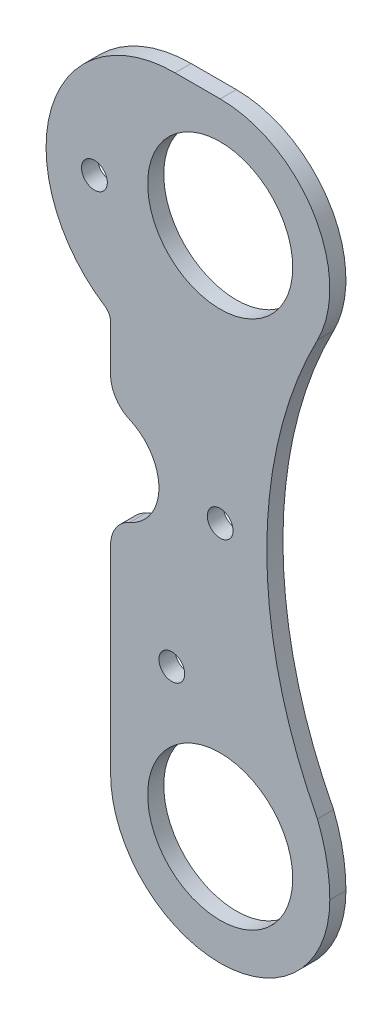
ISO-10303-21;
HEADER;
FILE_DESCRIPTION(('STEP AP214'),'2;1');
FILE_NAME('part.step','',(''),(''),'','','');
FILE_SCHEMA(('AUTOMOTIVE_DESIGN { 1 0 10303 214 1 1 1 1 }'));
ENDSEC;
DATA;
#1=APPLICATION_CONTEXT('core data for automotive mechanical design processes');
#2=APPLICATION_PROTOCOL_DEFINITION('international standard','automotive_design',2000,#1);
#3=PRODUCT_CONTEXT('',#1,'mechanical');
#4=PRODUCT('Part','Part','',(#3));
#5=PRODUCT_RELATED_PRODUCT_CATEGORY('part','',(#4));
#6=PRODUCT_DEFINITION_FORMATION('','',#4);
#7=PRODUCT_DEFINITION_CONTEXT('part definition',#1,'design');
#8=PRODUCT_DEFINITION('design','',#6,#7);
#9=PRODUCT_DEFINITION_SHAPE('','',#8);
#10=(LENGTH_UNIT() NAMED_UNIT(*) SI_UNIT(.MILLI.,.METRE.));
#11=(NAMED_UNIT(*) PLANE_ANGLE_UNIT() SI_UNIT($,.RADIAN.));
#12=(NAMED_UNIT(*) SI_UNIT($,.STERADIAN.) SOLID_ANGLE_UNIT());
#13=UNCERTAINTY_MEASURE_WITH_UNIT(LENGTH_MEASURE(1.E-05),#10,'distance_accuracy_value','');
#14=(GEOMETRIC_REPRESENTATION_CONTEXT(3) GLOBAL_UNCERTAINTY_ASSIGNED_CONTEXT((#13)) GLOBAL_UNIT_ASSIGNED_CONTEXT((#10,
#11,#12)) REPRESENTATION_CONTEXT('',''));
#15=CARTESIAN_POINT('',(0.,0.,0.));
#16=DIRECTION('',(0.,0.,1.));
#17=DIRECTION('',(1.,0.,0.));
#18=AXIS2_PLACEMENT_3D('',#15,#16,#17);
#19=CARTESIAN_POINT('',(0.,0.,3.175));
#20=DIRECTION('',(0.,0.,-1.));
#21=DIRECTION('',(-1.,0.,0.));
#22=AXIS2_PLACEMENT_3D('',#19,#20,#21);
#23=CYLINDRICAL_SURFACE('',#22,21.59);
#24=CARTESIAN_POINT('',(0.,0.,0.));
#25=DIRECTION('',(0.,0.,-1.));
#26=DIRECTION('',(-1.,0.,0.));
#27=AXIS2_PLACEMENT_3D('',#24,#25,#26);
#28=CIRCLE('',#27,21.59);
#29=CARTESIAN_POINT('',(0.,21.59,0.));
#30=VERTEX_POINT('',#29);
#31=CARTESIAN_POINT('',(19.1590830035103,-9.9527703914339,0.));
#32=VERTEX_POINT('',#31);
#33=EDGE_CURVE('E301',#30,#32,#28,.T.);
#34=ORIENTED_EDGE('',*,*,#33,.F.);
#35=DIRECTION('',(0.,0.,1.));
#36=VECTOR('',#35,1.);
#37=CARTESIAN_POINT('',(0.,21.59,0.));
#38=LINE('',#37,#36);
#39=CARTESIAN_POINT('',(0.,21.59,3.175));
#40=VERTEX_POINT('',#39);
#41=EDGE_CURVE('E212',#30,#40,#38,.T.);
#42=ORIENTED_EDGE('',*,*,#41,.T.);
#43=CARTESIAN_POINT('',(0.,0.,3.175));
#44=DIRECTION('',(0.,0.,-1.));
#45=DIRECTION('',(-1.,0.,0.));
#46=AXIS2_PLACEMENT_3D('',#43,#44,#45);
#47=CIRCLE('',#46,21.59);
#48=CARTESIAN_POINT('',(19.1590830035103,-9.9527703914339,3.175));
#49=VERTEX_POINT('',#48);
#50=EDGE_CURVE('E298',#40,#49,#47,.T.);
#51=ORIENTED_EDGE('',*,*,#50,.T.);
#52=DIRECTION('',(0.,0.,-1.));
#53=VECTOR('',#52,1.);
#54=CARTESIAN_POINT('',(19.1590830035103,-9.9527703914339,3.175));
#55=LINE('',#54,#53);
#56=EDGE_CURVE('E294',#49,#32,#55,.T.);
#57=ORIENTED_EDGE('',*,*,#56,.T.);
#58=EDGE_LOOP('',(#34,#42,#51,#57));
#59=FACE_BOUND('',#58,.T.);
#60=ADVANCED_FACE('F76',(#59),#23,.T.);
#61=CARTESIAN_POINT('',(8.89000000000001,12.7,3.175));
#62=DIRECTION('',(0.,0.,-1.));
#63=DIRECTION('',(-1.,0.,0.));
#64=AXIS2_PLACEMENT_3D('',#61,#62,#63);
#65=PLANE('',#64);
#66=CARTESIAN_POINT('',(-9.52499999999999,-80.01,3.175));
#67=DIRECTION('',(0.,0.,1.));
#68=DIRECTION('',(1.,0.,0.));
#69=AXIS2_PLACEMENT_3D('',#66,#67,#68);
#70=CIRCLE('',#69,2.53999999999999);
#71=CARTESIAN_POINT('',(-6.985,-80.01,3.175));
#72=VERTEX_POINT('',#71);
#73=EDGE_CURVE('E254',#72,#72,#70,.T.);
#74=ORIENTED_EDGE('',*,*,#73,.F.);
#75=EDGE_LOOP('',(#74));
#76=FACE_BOUND('',#75,.T.);
#77=CARTESIAN_POINT('',(0.,-104.23906,3.175));
#78=DIRECTION('',(0.,0.,1.));
#79=DIRECTION('',(1.,0.,0.));
#80=AXIS2_PLACEMENT_3D('',#77,#78,#79);
#81=CIRCLE('',#80,14.2875);
#82=CARTESIAN_POINT('',(14.2875,-104.23906,3.175));
#83=VERTEX_POINT('',#82);
#84=EDGE_CURVE('E245',#83,#83,#81,.T.);
#85=ORIENTED_EDGE('',*,*,#84,.F.);
#86=EDGE_LOOP('',(#85));
#87=FACE_BOUND('',#86,.T.);
#88=CARTESIAN_POINT('',(0.,-104.23906,3.175));
#89=DIRECTION('',(0.,0.,1.));
#90=DIRECTION('',(1.,0.,0.));
#91=AXIS2_PLACEMENT_3D('',#88,#89,#90);
#92=CIRCLE('',#91,21.59);
#93=CARTESIAN_POINT('',(-21.59,-104.23906,3.175));
#94=VERTEX_POINT('',#93);
#95=CARTESIAN_POINT('',(21.59,-104.23906,3.175));
#96=VERTEX_POINT('',#95);
#97=EDGE_CURVE('E185',#94,#96,#92,.T.);
#98=ORIENTED_EDGE('',*,*,#97,.T.);
#99=CARTESIAN_POINT('',(-12.2374713385836,-104.23906,3.175));
#100=DIRECTION('',(0.,0.,-1.));
#101=DIRECTION('',(-1.,0.,0.));
#102=AXIS2_PLACEMENT_3D('',#99,#100,#101);
#103=CIRCLE('',#102,33.8274713385836);
#104=CARTESIAN_POINT('',(19.1590830035103,-91.6472296085661,3.175));
#105=VERTEX_POINT('',#104);
#106=EDGE_CURVE('E168',#105,#96,#103,.T.);
#107=ORIENTED_EDGE('',*,*,#106,.F.);
#108=CARTESIAN_POINT('',(97.79,-50.8,3.175));
#109=DIRECTION('',(0.,0.,-1.));
#110=DIRECTION('',(-1.,0.,0.));
#111=AXIS2_PLACEMENT_3D('',#108,#109,#110);
#112=CIRCLE('',#111,88.6076592310381);
#113=EDGE_CURVE('E223',#105,#49,#112,.T.);
#114=ORIENTED_EDGE('',*,*,#113,.T.);
#115=ORIENTED_EDGE('',*,*,#50,.F.);
#116=DIRECTION('',(1.,0.,0.));
#117=VECTOR('',#116,1.);
#118=CARTESIAN_POINT('',(0.,21.59,3.175));
#119=LINE('',#118,#117);
#120=CARTESIAN_POINT('',(-8.89,21.59,3.175));
#121=VERTEX_POINT('',#120);
#122=EDGE_CURVE('E208',#121,#40,#119,.T.);
#123=ORIENTED_EDGE('',*,*,#122,.F.);
#124=CARTESIAN_POINT('',(-8.89,-3.81,3.175));
#125=DIRECTION('',(0.,0.,1.));
#126=DIRECTION('',(1.,0.,0.));
#127=AXIS2_PLACEMENT_3D('',#124,#125,#126);
#128=CIRCLE('',#127,25.4);
#129=CARTESIAN_POINT('',(-22.7445454545454,-25.0987662922945,3.175));
#130=VERTEX_POINT('',#129);
#131=EDGE_CURVE('E199',#121,#130,#128,.T.);
#132=ORIENTED_EDGE('',*,*,#131,.T.);
#133=CARTESIAN_POINT('',(-24.13,-27.2276429215239,3.175));
#134=DIRECTION('',(0.,0.,-1.));
#135=DIRECTION('',(-1.,0.,0.));
#136=AXIS2_PLACEMENT_3D('',#133,#134,#135);
#137=CIRCLE('',#136,2.54);
#138=CARTESIAN_POINT('',(-21.59,-27.2276429215239,3.175));
#139=VERTEX_POINT('',#138);
#140=EDGE_CURVE('E84',#130,#139,#137,.T.);
#141=ORIENTED_EDGE('',*,*,#140,.T.);
#142=DIRECTION('',(0.,-1.,0.));
#143=VECTOR('',#142,1.);
#144=CARTESIAN_POINT('',(-21.59,12.7,3.175));
#145=LINE('',#144,#143);
#146=CARTESIAN_POINT('',(-21.59,-36.2503221685152,3.175));
#147=VERTEX_POINT('',#146);
#148=EDGE_CURVE('E346',#139,#147,#145,.T.);
#149=ORIENTED_EDGE('',*,*,#148,.T.);
#150=CARTESIAN_POINT('',(-15.24,-36.2503221685152,3.175));
#151=DIRECTION('',(0.,0.,-1.));
#152=DIRECTION('',(-1.,0.,0.));
#153=AXIS2_PLACEMENT_3D('',#150,#151,#152);
#154=CIRCLE('',#153,6.35);
#155=CARTESIAN_POINT('',(-17.78,-42.0701933011091,3.175));
#156=VERTEX_POINT('',#155);
#157=EDGE_CURVE('E327',#147,#156,#154,.F.);
#158=ORIENTED_EDGE('',*,*,#157,.T.);
#159=CARTESIAN_POINT('',(-21.59,-50.8,3.175));
#160=DIRECTION('',(0.,0.,1.));
#161=DIRECTION('',(1.,0.,0.));
#162=AXIS2_PLACEMENT_3D('',#159,#160,#161);
#163=CIRCLE('',#162,9.525);
#164=CARTESIAN_POINT('',(-17.78,-59.5298066988909,3.175));
#165=VERTEX_POINT('',#164);
#166=EDGE_CURVE('E215',#165,#156,#163,.T.);
#167=ORIENTED_EDGE('',*,*,#166,.F.);
#168=CARTESIAN_POINT('',(-15.24,-65.3496778314848,3.175));
#169=DIRECTION('',(0.,0.,-1.));
#170=DIRECTION('',(-1.,0.,0.));
#171=AXIS2_PLACEMENT_3D('',#168,#169,#170);
#172=CIRCLE('',#171,6.35);
#173=CARTESIAN_POINT('',(-21.59,-65.3496778314848,3.175));
#174=VERTEX_POINT('',#173);
#175=EDGE_CURVE('E331',#165,#174,#172,.F.);
#176=ORIENTED_EDGE('',*,*,#175,.T.);
#177=EDGE_CURVE('E348',#174,#94,#145,.T.);
#178=ORIENTED_EDGE('',*,*,#177,.T.);
#179=EDGE_LOOP('',(#98,#107,#114,#115,#123,#132,#141,#149,#158,#167,#176,#178));
#180=FACE_BOUND('',#179,.T.);
#181=CARTESIAN_POINT('',(-24.765,-3.81,3.175));
#182=DIRECTION('',(0.,0.,1.));
#183=DIRECTION('',(1.,0.,0.));
#184=AXIS2_PLACEMENT_3D('',#181,#182,#183);
#185=CIRCLE('',#184,2.54);
#186=CARTESIAN_POINT('',(-22.225,-3.81,3.175));
#187=VERTEX_POINT('',#186);
#188=EDGE_CURVE('E173',#187,#187,#185,.T.);
#189=ORIENTED_EDGE('',*,*,#188,.F.);
#190=EDGE_LOOP('',(#189));
#191=FACE_BOUND('',#190,.T.);
#192=CARTESIAN_POINT('',(0.,-50.8,3.175));
#193=DIRECTION('',(0.,0.,1.));
#194=DIRECTION('',(1.,0.,0.));
#195=AXIS2_PLACEMENT_3D('',#192,#193,#194);
#196=CIRCLE('',#195,2.54);
#197=CARTESIAN_POINT('',(2.54000000000001,-50.8,3.175));
#198=VERTEX_POINT('',#197);
#199=EDGE_CURVE('E280',#198,#198,#196,.T.);
#200=ORIENTED_EDGE('',*,*,#199,.F.);
#201=EDGE_LOOP('',(#200));
#202=FACE_BOUND('',#201,.T.);
#203=CARTESIAN_POINT('',(0.,0.,3.175));
#204=DIRECTION('',(0.,0.,1.));
#205=DIRECTION('',(1.,0.,0.));
#206=AXIS2_PLACEMENT_3D('',#203,#204,#205);
#207=CIRCLE('',#206,14.2875);
#208=CARTESIAN_POINT('',(14.2875,0.,3.175));
#209=VERTEX_POINT('',#208);
#210=EDGE_CURVE('E230',#209,#209,#207,.T.);
#211=ORIENTED_EDGE('',*,*,#210,.F.);
#212=EDGE_LOOP('',(#211));
#213=FACE_BOUND('',#212,.T.);
#214=ADVANCED_FACE('F269',(#76,#87,#180,#191,#202,#213),#65,.F.);
#215=CARTESIAN_POINT('',(8.89000000000001,12.7,0.));
#216=DIRECTION('',(0.,0.,-1.));
#217=DIRECTION('',(-1.,0.,0.));
#218=AXIS2_PLACEMENT_3D('',#215,#216,#217);
#219=PLANE('',#218);
#220=CARTESIAN_POINT('',(-9.52499999999999,-80.01,0.));
#221=DIRECTION('',(0.,0.,1.));
#222=DIRECTION('',(1.,0.,0.));
#223=AXIS2_PLACEMENT_3D('',#220,#221,#222);
#224=CIRCLE('',#223,2.53999999999999);
#225=CARTESIAN_POINT('',(-6.985,-80.01,0.));
#226=VERTEX_POINT('',#225);
#227=EDGE_CURVE('E249',#226,#226,#224,.T.);
#228=ORIENTED_EDGE('',*,*,#227,.T.);
#229=EDGE_LOOP('',(#228));
#230=FACE_BOUND('',#229,.T.);
#231=CARTESIAN_POINT('',(0.,-104.23906,0.));
#232=DIRECTION('',(0.,0.,1.));
#233=DIRECTION('',(1.,0.,0.));
#234=AXIS2_PLACEMENT_3D('',#231,#232,#233);
#235=CIRCLE('',#234,14.2875);
#236=CARTESIAN_POINT('',(14.2875,-104.23906,0.));
#237=VERTEX_POINT('',#236);
#238=EDGE_CURVE('E248',#237,#237,#235,.T.);
#239=ORIENTED_EDGE('',*,*,#238,.T.);
#240=EDGE_LOOP('',(#239));
#241=FACE_BOUND('',#240,.T.);
#242=CARTESIAN_POINT('',(-12.2374713385836,-104.23906,0.));
#243=DIRECTION('',(0.,0.,-1.));
#244=DIRECTION('',(-1.,0.,0.));
#245=AXIS2_PLACEMENT_3D('',#242,#243,#244);
#246=CIRCLE('',#245,33.8274713385836);
#247=CARTESIAN_POINT('',(19.1590830035103,-91.6472296085661,0.));
#248=VERTEX_POINT('',#247);
#249=CARTESIAN_POINT('',(21.59,-104.23906,0.));
#250=VERTEX_POINT('',#249);
#251=EDGE_CURVE('E165',#248,#250,#246,.T.);
#252=ORIENTED_EDGE('',*,*,#251,.T.);
#253=CARTESIAN_POINT('',(0.,-104.23906,0.));
#254=DIRECTION('',(0.,0.,1.));
#255=DIRECTION('',(1.,0.,0.));
#256=AXIS2_PLACEMENT_3D('',#253,#254,#255);
#257=CIRCLE('',#256,21.59);
#258=CARTESIAN_POINT('',(-21.59,-104.23906,0.));
#259=VERTEX_POINT('',#258);
#260=EDGE_CURVE('E182',#259,#250,#257,.T.);
#261=ORIENTED_EDGE('',*,*,#260,.F.);
#262=DIRECTION('',(0.,-1.,0.));
#263=VECTOR('',#262,1.);
#264=CARTESIAN_POINT('',(-21.59,12.7,0.));
#265=LINE('',#264,#263);
#266=CARTESIAN_POINT('',(-21.59,-65.3496778314848,0.));
#267=VERTEX_POINT('',#266);
#268=EDGE_CURVE('E235',#267,#259,#265,.T.);
#269=ORIENTED_EDGE('',*,*,#268,.F.);
#270=CARTESIAN_POINT('',(-15.24,-65.3496778314848,0.));
#271=DIRECTION('',(0.,0.,-1.));
#272=DIRECTION('',(-1.,0.,0.));
#273=AXIS2_PLACEMENT_3D('',#270,#271,#272);
#274=CIRCLE('',#273,6.35);
#275=CARTESIAN_POINT('',(-17.78,-59.5298066988909,0.));
#276=VERTEX_POINT('',#275);
#277=EDGE_CURVE('E339',#267,#276,#274,.T.);
#278=ORIENTED_EDGE('',*,*,#277,.T.);
#279=CARTESIAN_POINT('',(-21.59,-50.8,0.));
#280=DIRECTION('',(0.,0.,1.));
#281=DIRECTION('',(1.,0.,0.));
#282=AXIS2_PLACEMENT_3D('',#279,#280,#281);
#283=CIRCLE('',#282,9.525);
#284=CARTESIAN_POINT('',(-17.78,-42.0701933011091,0.));
#285=VERTEX_POINT('',#284);
#286=EDGE_CURVE('E217',#276,#285,#283,.T.);
#287=ORIENTED_EDGE('',*,*,#286,.T.);
#288=CARTESIAN_POINT('',(-15.24,-36.2503221685152,0.));
#289=DIRECTION('',(0.,0.,-1.));
#290=DIRECTION('',(-1.,0.,0.));
#291=AXIS2_PLACEMENT_3D('',#288,#289,#290);
#292=CIRCLE('',#291,6.35);
#293=CARTESIAN_POINT('',(-21.59,-36.2503221685152,0.));
#294=VERTEX_POINT('',#293);
#295=EDGE_CURVE('E336',#285,#294,#292,.T.);
#296=ORIENTED_EDGE('',*,*,#295,.T.);
#297=CARTESIAN_POINT('',(-21.59,-27.2276429215239,0.));
#298=VERTEX_POINT('',#297);
#299=EDGE_CURVE('E347',#298,#294,#265,.T.);
#300=ORIENTED_EDGE('',*,*,#299,.F.);
#301=CARTESIAN_POINT('',(-24.13,-27.2276429215239,0.));
#302=DIRECTION('',(0.,0.,-1.));
#303=DIRECTION('',(-1.,0.,0.));
#304=AXIS2_PLACEMENT_3D('',#301,#302,#303);
#305=CIRCLE('',#304,2.54);
#306=CARTESIAN_POINT('',(-22.7445454545454,-25.0987662922945,0.));
#307=VERTEX_POINT('',#306);
#308=EDGE_CURVE('E13',#298,#307,#305,.F.);
#309=ORIENTED_EDGE('',*,*,#308,.T.);
#310=CARTESIAN_POINT('',(-8.89,-3.81,0.));
#311=DIRECTION('',(0.,0.,1.));
#312=DIRECTION('',(1.,0.,0.));
#313=AXIS2_PLACEMENT_3D('',#310,#311,#312);
#314=CIRCLE('',#313,25.4);
#315=CARTESIAN_POINT('',(-8.89,21.59,0.));
#316=VERTEX_POINT('',#315);
#317=EDGE_CURVE('E202',#316,#307,#314,.T.);
#318=ORIENTED_EDGE('',*,*,#317,.F.);
#319=DIRECTION('',(1.,0.,0.));
#320=VECTOR('',#319,1.);
#321=CARTESIAN_POINT('',(0.,21.59,0.));
#322=LINE('',#321,#320);
#323=EDGE_CURVE('E198',#316,#30,#322,.T.);
#324=ORIENTED_EDGE('',*,*,#323,.T.);
#325=ORIENTED_EDGE('',*,*,#33,.T.);
#326=CARTESIAN_POINT('',(97.79,-50.8,0.));
#327=DIRECTION('',(0.,0.,-1.));
#328=DIRECTION('',(-1.,0.,0.));
#329=AXIS2_PLACEMENT_3D('',#326,#327,#328);
#330=CIRCLE('',#329,88.6076592310381);
#331=EDGE_CURVE('E184',#248,#32,#330,.T.);
#332=ORIENTED_EDGE('',*,*,#331,.F.);
#333=EDGE_LOOP('',(#252,#261,#269,#278,#287,#296,#300,#309,#318,#324,#325,#332));
#334=FACE_BOUND('',#333,.T.);
#335=CARTESIAN_POINT('',(0.,-50.8,0.));
#336=DIRECTION('',(0.,0.,1.));
#337=DIRECTION('',(1.,0.,0.));
#338=AXIS2_PLACEMENT_3D('',#335,#336,#337);
#339=CIRCLE('',#338,2.54);
#340=CARTESIAN_POINT('',(2.54000000000001,-50.8,0.));
#341=VERTEX_POINT('',#340);
#342=EDGE_CURVE('E237',#341,#341,#339,.T.);
#343=ORIENTED_EDGE('',*,*,#342,.T.);
#344=EDGE_LOOP('',(#343));
#345=FACE_BOUND('',#344,.T.);
#346=CARTESIAN_POINT('',(0.,0.,0.));
#347=DIRECTION('',(0.,0.,1.));
#348=DIRECTION('',(1.,0.,0.));
#349=AXIS2_PLACEMENT_3D('',#346,#347,#348);
#350=CIRCLE('',#349,14.2875);
#351=CARTESIAN_POINT('',(14.2875,0.,0.));
#352=VERTEX_POINT('',#351);
#353=EDGE_CURVE('E236',#352,#352,#350,.T.);
#354=ORIENTED_EDGE('',*,*,#353,.T.);
#355=EDGE_LOOP('',(#354));
#356=FACE_BOUND('',#355,.T.);
#357=CARTESIAN_POINT('',(-24.765,-3.81,0.));
#358=DIRECTION('',(0.,0.,1.));
#359=DIRECTION('',(1.,0.,0.));
#360=AXIS2_PLACEMENT_3D('',#357,#358,#359);
#361=CIRCLE('',#360,2.54);
#362=CARTESIAN_POINT('',(-22.225,-3.81,0.));
#363=VERTEX_POINT('',#362);
#364=EDGE_CURVE('E195',#363,#363,#361,.T.);
#365=ORIENTED_EDGE('',*,*,#364,.T.);
#366=EDGE_LOOP('',(#365));
#367=FACE_BOUND('',#366,.T.);
#368=ADVANCED_FACE('F179',(#230,#241,#334,#345,#356,#367),#219,.T.);
#369=CARTESIAN_POINT('',(-21.59,12.7,3.175));
#370=DIRECTION('',(1.,0.,0.));
#371=DIRECTION('',(0.,1.,0.));
#372=AXIS2_PLACEMENT_3D('',#369,#370,#371);
#373=PLANE('',#372);
#374=ORIENTED_EDGE('',*,*,#268,.T.);
#375=DIRECTION('',(0.,0.,1.));
#376=VECTOR('',#375,1.);
#377=CARTESIAN_POINT('',(-21.59,-104.23906,0.));
#378=LINE('',#377,#376);
#379=EDGE_CURVE('E174',#259,#94,#378,.T.);
#380=ORIENTED_EDGE('',*,*,#379,.T.);
#381=ORIENTED_EDGE('',*,*,#177,.F.);
#382=DIRECTION('',(0.,0.,1.));
#383=VECTOR('',#382,1.);
#384=CARTESIAN_POINT('',(-21.59,-65.3496778314848,0.));
#385=LINE('',#384,#383);
#386=EDGE_CURVE('E323',#174,#267,#385,.F.);
#387=ORIENTED_EDGE('',*,*,#386,.T.);
#388=EDGE_LOOP('',(#374,#380,#381,#387));
#389=FACE_BOUND('',#388,.T.);
#390=ADVANCED_FACE('F355',(#389),#373,.F.);
#391=ORIENTED_EDGE('',*,*,#148,.F.);
#392=DIRECTION('',(0.,0.,1.));
#393=VECTOR('',#392,1.);
#394=CARTESIAN_POINT('',(-21.59,-27.2276429215239,3.175));
#395=LINE('',#394,#393);
#396=EDGE_CURVE('E91',#139,#298,#395,.F.);
#397=ORIENTED_EDGE('',*,*,#396,.T.);
#398=ORIENTED_EDGE('',*,*,#299,.T.);
#399=DIRECTION('',(0.,0.,1.));
#400=VECTOR('',#399,1.);
#401=CARTESIAN_POINT('',(-21.59,-36.2503221685152,3.175));
#402=LINE('',#401,#400);
#403=EDGE_CURVE('E333',#294,#147,#402,.T.);
#404=ORIENTED_EDGE('',*,*,#403,.T.);
#405=EDGE_LOOP('',(#391,#397,#398,#404));
#406=FACE_BOUND('',#405,.T.);
#407=ADVANCED_FACE('F287',(#406),#373,.F.);
#408=CARTESIAN_POINT('',(0.,0.,3.175));
#409=DIRECTION('',(0.,0.,-1.));
#410=DIRECTION('',(-1.,0.,0.));
#411=AXIS2_PLACEMENT_3D('',#408,#409,#410);
#412=CYLINDRICAL_SURFACE('',#411,14.2875);
#413=ORIENTED_EDGE('',*,*,#210,.T.);
#414=EDGE_LOOP('',(#413));
#415=FACE_BOUND('',#414,.T.);
#416=ORIENTED_EDGE('',*,*,#353,.F.);
#417=EDGE_LOOP('',(#416));
#418=FACE_BOUND('',#417,.T.);
#419=ADVANCED_FACE('F283',(#415,#418),#412,.F.);
#420=CARTESIAN_POINT('',(0.,-50.8,3.175));
#421=DIRECTION('',(0.,0.,-1.));
#422=DIRECTION('',(-1.,0.,0.));
#423=AXIS2_PLACEMENT_3D('',#420,#421,#422);
#424=CYLINDRICAL_SURFACE('',#423,2.54);
#425=ORIENTED_EDGE('',*,*,#199,.T.);
#426=EDGE_LOOP('',(#425));
#427=FACE_BOUND('',#426,.T.);
#428=ORIENTED_EDGE('',*,*,#342,.F.);
#429=EDGE_LOOP('',(#428));
#430=FACE_BOUND('',#429,.T.);
#431=ADVANCED_FACE('F286',(#427,#430),#424,.F.);
#432=CARTESIAN_POINT('',(97.79,-50.8,3.175));
#433=DIRECTION('',(0.,0.,-1.));
#434=DIRECTION('',(-1.,0.,0.));
#435=AXIS2_PLACEMENT_3D('',#432,#433,#434);
#436=CYLINDRICAL_SURFACE('',#435,88.6076592310381);
#437=ORIENTED_EDGE('',*,*,#331,.T.);
#438=ORIENTED_EDGE('',*,*,#56,.F.);
#439=ORIENTED_EDGE('',*,*,#113,.F.);
#440=DIRECTION('',(0.,0.,-1.));
#441=VECTOR('',#440,1.);
#442=CARTESIAN_POINT('',(19.1590830035103,-91.6472296085661,3.175));
#443=LINE('',#442,#441);
#444=EDGE_CURVE('E296',#105,#248,#443,.T.);
#445=ORIENTED_EDGE('',*,*,#444,.T.);
#446=EDGE_LOOP('',(#437,#438,#439,#445));
#447=FACE_BOUND('',#446,.T.);
#448=ADVANCED_FACE('F309',(#447),#436,.F.);
#449=CARTESIAN_POINT('',(-21.59,-50.8,3.175));
#450=DIRECTION('',(0.,0.,-1.));
#451=DIRECTION('',(-1.,0.,0.));
#452=AXIS2_PLACEMENT_3D('',#449,#450,#451);
#453=CYLINDRICAL_SURFACE('',#452,9.525);
#454=ORIENTED_EDGE('',*,*,#166,.T.);
#455=DIRECTION('',(0.,0.,-1.));
#456=VECTOR('',#455,1.);
#457=CARTESIAN_POINT('',(-17.78,-42.0701933011091,3.175));
#458=LINE('',#457,#456);
#459=EDGE_CURVE('E341',#156,#285,#458,.T.);
#460=ORIENTED_EDGE('',*,*,#459,.T.);
#461=ORIENTED_EDGE('',*,*,#286,.F.);
#462=DIRECTION('',(0.,0.,-1.));
#463=VECTOR('',#462,1.);
#464=CARTESIAN_POINT('',(-17.78,-59.5298066988909,3.175));
#465=LINE('',#464,#463);
#466=EDGE_CURVE('E344',#276,#165,#465,.F.);
#467=ORIENTED_EDGE('',*,*,#466,.T.);
#468=EDGE_LOOP('',(#454,#460,#461,#467));
#469=FACE_BOUND('',#468,.T.);
#470=ADVANCED_FACE('F360',(#469),#453,.F.);
#471=CARTESIAN_POINT('',(-15.24,-36.2503221685152,3.175));
#472=DIRECTION('',(0.,0.,-1.));
#473=DIRECTION('',(-1.,0.,0.));
#474=AXIS2_PLACEMENT_3D('',#471,#472,#473);
#475=CYLINDRICAL_SURFACE('',#474,6.35);
#476=ORIENTED_EDGE('',*,*,#157,.F.);
#477=ORIENTED_EDGE('',*,*,#403,.F.);
#478=ORIENTED_EDGE('',*,*,#295,.F.);
#479=ORIENTED_EDGE('',*,*,#459,.F.);
#480=EDGE_LOOP('',(#476,#477,#478,#479));
#481=FACE_BOUND('',#480,.T.);
#482=ADVANCED_FACE('F364',(#481),#475,.T.);
#483=CARTESIAN_POINT('',(-15.24,-65.3496778314848,3.175));
#484=DIRECTION('',(0.,0.,-1.));
#485=DIRECTION('',(-1.,0.,0.));
#486=AXIS2_PLACEMENT_3D('',#483,#484,#485);
#487=CYLINDRICAL_SURFACE('',#486,6.35);
#488=ORIENTED_EDGE('',*,*,#175,.F.);
#489=ORIENTED_EDGE('',*,*,#466,.F.);
#490=ORIENTED_EDGE('',*,*,#277,.F.);
#491=ORIENTED_EDGE('',*,*,#386,.F.);
#492=EDGE_LOOP('',(#488,#489,#490,#491));
#493=FACE_BOUND('',#492,.T.);
#494=ADVANCED_FACE('F362',(#493),#487,.T.);
#495=CARTESIAN_POINT('',(0.,21.59,0.));
#496=DIRECTION('',(0.,-1.,0.));
#497=DIRECTION('',(0.,0.,-1.));
#498=AXIS2_PLACEMENT_3D('',#495,#496,#497);
#499=PLANE('',#498);
#500=ORIENTED_EDGE('',*,*,#122,.T.);
#501=ORIENTED_EDGE('',*,*,#41,.F.);
#502=ORIENTED_EDGE('',*,*,#323,.F.);
#503=DIRECTION('',(0.,0.,1.));
#504=VECTOR('',#503,1.);
#505=CARTESIAN_POINT('',(-8.89,21.59,0.));
#506=LINE('',#505,#504);
#507=EDGE_CURVE('E205',#316,#121,#506,.T.);
#508=ORIENTED_EDGE('',*,*,#507,.T.);
#509=EDGE_LOOP('',(#500,#501,#502,#508));
#510=FACE_BOUND('',#509,.T.);
#511=ADVANCED_FACE('F314',(#510),#499,.F.);
#512=CARTESIAN_POINT('',(-24.765,-3.81,0.));
#513=DIRECTION('',(0.,0.,1.));
#514=DIRECTION('',(1.,0.,0.));
#515=AXIS2_PLACEMENT_3D('',#512,#513,#514);
#516=CYLINDRICAL_SURFACE('',#515,2.54);
#517=ORIENTED_EDGE('',*,*,#364,.F.);
#518=EDGE_LOOP('',(#517));
#519=FACE_BOUND('',#518,.T.);
#520=ORIENTED_EDGE('',*,*,#188,.T.);
#521=EDGE_LOOP('',(#520));
#522=FACE_BOUND('',#521,.T.);
#523=ADVANCED_FACE('F369',(#519,#522),#516,.F.);
#524=CARTESIAN_POINT('',(-8.89,-3.81,0.));
#525=DIRECTION('',(0.,0.,1.));
#526=DIRECTION('',(1.,0.,0.));
#527=AXIS2_PLACEMENT_3D('',#524,#525,#526);
#528=CYLINDRICAL_SURFACE('',#527,25.4);
#529=ORIENTED_EDGE('',*,*,#317,.T.);
#530=DIRECTION('',(0.,0.,1.));
#531=VECTOR('',#530,1.);
#532=CARTESIAN_POINT('',(-22.7445454545455,-25.0987662922945,0.));
#533=LINE('',#532,#531);
#534=EDGE_CURVE('E320',#307,#130,#533,.T.);
#535=ORIENTED_EDGE('',*,*,#534,.T.);
#536=ORIENTED_EDGE('',*,*,#131,.F.);
#537=ORIENTED_EDGE('',*,*,#507,.F.);
#538=EDGE_LOOP('',(#529,#535,#536,#537));
#539=FACE_BOUND('',#538,.T.);
#540=ADVANCED_FACE('F318',(#539),#528,.T.);
#541=CARTESIAN_POINT('',(-24.13,-27.2276429215239,0.));
#542=DIRECTION('',(0.,0.,1.));
#543=DIRECTION('',(1.,0.,0.));
#544=AXIS2_PLACEMENT_3D('',#541,#542,#543);
#545=CYLINDRICAL_SURFACE('',#544,2.54);
#546=ORIENTED_EDGE('',*,*,#308,.F.);
#547=ORIENTED_EDGE('',*,*,#396,.F.);
#548=ORIENTED_EDGE('',*,*,#140,.F.);
#549=ORIENTED_EDGE('',*,*,#534,.F.);
#550=EDGE_LOOP('',(#546,#547,#548,#549));
#551=FACE_BOUND('',#550,.T.);
#552=ADVANCED_FACE('F78',(#551),#545,.F.);
#553=CARTESIAN_POINT('',(0.,-104.23906,0.));
#554=DIRECTION('',(0.,0.,1.));
#555=DIRECTION('',(1.,0.,0.));
#556=AXIS2_PLACEMENT_3D('',#553,#554,#555);
#557=CYLINDRICAL_SURFACE('',#556,21.59);
#558=ORIENTED_EDGE('',*,*,#97,.F.);
#559=ORIENTED_EDGE('',*,*,#379,.F.);
#560=ORIENTED_EDGE('',*,*,#260,.T.);
#561=DIRECTION('',(0.,0.,1.));
#562=VECTOR('',#561,1.);
#563=CARTESIAN_POINT('',(21.59,-104.23906,0.));
#564=LINE('',#563,#562);
#565=EDGE_CURVE('E162',#250,#96,#564,.T.);
#566=ORIENTED_EDGE('',*,*,#565,.T.);
#567=EDGE_LOOP('',(#558,#559,#560,#566));
#568=FACE_BOUND('',#567,.T.);
#569=ADVANCED_FACE('F188',(#568),#557,.T.);
#570=CARTESIAN_POINT('',(-12.2374713385836,-104.23906,0.));
#571=DIRECTION('',(0.,0.,1.));
#572=DIRECTION('',(1.,0.,0.));
#573=AXIS2_PLACEMENT_3D('',#570,#571,#572);
#574=CYLINDRICAL_SURFACE('',#573,33.8274713385836);
#575=ORIENTED_EDGE('',*,*,#106,.T.);
#576=ORIENTED_EDGE('',*,*,#565,.F.);
#577=ORIENTED_EDGE('',*,*,#251,.F.);
#578=ORIENTED_EDGE('',*,*,#444,.F.);
#579=EDGE_LOOP('',(#575,#576,#577,#578));
#580=FACE_BOUND('',#579,.T.);
#581=ADVANCED_FACE('F164',(#580),#574,.T.);
#582=CARTESIAN_POINT('',(0.,-104.23906,0.));
#583=DIRECTION('',(0.,0.,1.));
#584=DIRECTION('',(1.,0.,0.));
#585=AXIS2_PLACEMENT_3D('',#582,#583,#584);
#586=CYLINDRICAL_SURFACE('',#585,14.2875);
#587=ORIENTED_EDGE('',*,*,#238,.F.);
#588=EDGE_LOOP('',(#587));
#589=FACE_BOUND('',#588,.T.);
#590=ORIENTED_EDGE('',*,*,#84,.T.);
#591=EDGE_LOOP('',(#590));
#592=FACE_BOUND('',#591,.T.);
#593=ADVANCED_FACE('F265',(#589,#592),#586,.F.);
#594=CARTESIAN_POINT('',(-9.52499999999999,-80.01,0.));
#595=DIRECTION('',(0.,0.,1.));
#596=DIRECTION('',(1.,0.,0.));
#597=AXIS2_PLACEMENT_3D('',#594,#595,#596);
#598=CYLINDRICAL_SURFACE('',#597,2.53999999999999);
#599=ORIENTED_EDGE('',*,*,#227,.F.);
#600=EDGE_LOOP('',(#599));
#601=FACE_BOUND('',#600,.T.);
#602=ORIENTED_EDGE('',*,*,#73,.T.);
#603=EDGE_LOOP('',(#602));
#604=FACE_BOUND('',#603,.T.);
#605=ADVANCED_FACE('F262',(#601,#604),#598,.F.);
#606=CLOSED_SHELL('',(#60,#214,#368,#390,#407,#419,#431,#448,#470,#482,#494,#511,#523,#540,#552,
#569,#581,#593,#605));
#607=MANIFOLD_SOLID_BREP('B2',#606);
#608=ADVANCED_BREP_SHAPE_REPRESENTATION('',(#18,#607),#14);
#609=SHAPE_DEFINITION_REPRESENTATION(#9,#608);
ENDSEC;
END-ISO-10303-21;
